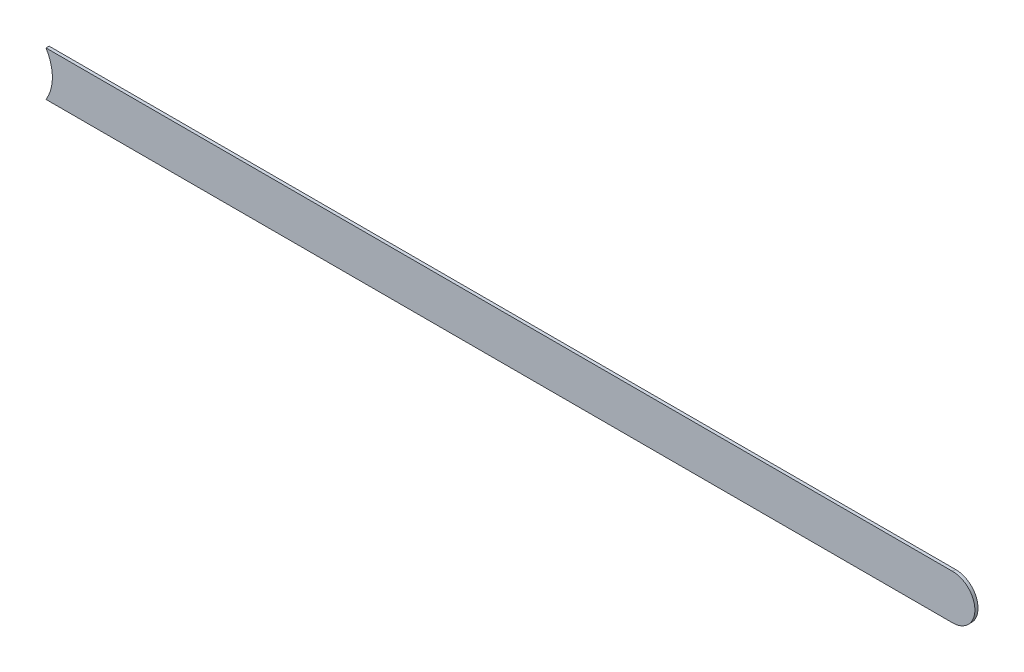
ISO-10303-21;
HEADER;
FILE_DESCRIPTION(('STEP AP214'),'2;1');
FILE_NAME('part.step','',(''),(''),'','','');
FILE_SCHEMA(('AUTOMOTIVE_DESIGN { 1 0 10303 214 1 1 1 1 }'));
ENDSEC;
DATA;
#1=APPLICATION_CONTEXT('core data for automotive mechanical design processes');
#2=APPLICATION_PROTOCOL_DEFINITION('international standard','automotive_design',2000,#1);
#3=PRODUCT_CONTEXT('',#1,'mechanical');
#4=PRODUCT('Part','Part','',(#3));
#5=PRODUCT_RELATED_PRODUCT_CATEGORY('part','',(#4));
#6=PRODUCT_DEFINITION_FORMATION('','',#4);
#7=PRODUCT_DEFINITION_CONTEXT('part definition',#1,'design');
#8=PRODUCT_DEFINITION('design','',#6,#7);
#9=PRODUCT_DEFINITION_SHAPE('','',#8);
#10=(LENGTH_UNIT() NAMED_UNIT(*) SI_UNIT(.MILLI.,.METRE.));
#11=(NAMED_UNIT(*) PLANE_ANGLE_UNIT() SI_UNIT($,.RADIAN.));
#12=(NAMED_UNIT(*) SI_UNIT($,.STERADIAN.) SOLID_ANGLE_UNIT());
#13=UNCERTAINTY_MEASURE_WITH_UNIT(LENGTH_MEASURE(1.E-05),#10,'distance_accuracy_value','');
#14=(GEOMETRIC_REPRESENTATION_CONTEXT(3) GLOBAL_UNCERTAINTY_ASSIGNED_CONTEXT((#13)) GLOBAL_UNIT_ASSIGNED_CONTEXT((#10,
#11,#12)) REPRESENTATION_CONTEXT('',''));
#15=CARTESIAN_POINT('',(0.,0.,0.));
#16=DIRECTION('',(0.,0.,1.));
#17=DIRECTION('',(1.,0.,0.));
#18=AXIS2_PLACEMENT_3D('',#15,#16,#17);
#19=CARTESIAN_POINT('',(80.,-100.126,1.6));
#20=DIRECTION('',(0.,1.,0.));
#21=DIRECTION('',(1.,0.,0.));
#22=AXIS2_PLACEMENT_3D('',#19,#20,#21);
#23=PLANE('',#22);
#24=DIRECTION('',(0.,0.,1.));
#25=VECTOR('',#24,1.);
#26=CARTESIAN_POINT('',(90.564,-100.126,1.6));
#27=LINE('',#26,#25);
#28=CARTESIAN_POINT('',(90.564,-100.126,1.6));
#29=VERTEX_POINT('',#28);
#30=CARTESIAN_POINT('',(90.564,-100.126,1.635));
#31=VERTEX_POINT('',#30);
#32=EDGE_CURVE('E11',#29,#31,#27,.T.);
#33=ORIENTED_EDGE('',*,*,#32,.T.);
#34=DIRECTION('',(1.,0.,0.));
#35=VECTOR('',#34,1.);
#36=CARTESIAN_POINT('',(80.,-100.126,1.635));
#37=LINE('',#36,#35);
#38=CARTESIAN_POINT('',(80.403887360534,-100.126,1.635));
#39=VERTEX_POINT('',#38);
#40=EDGE_CURVE('E20',#39,#31,#37,.T.);
#41=ORIENTED_EDGE('',*,*,#40,.F.);
#42=DIRECTION('',(0.,0.,-1.));
#43=VECTOR('',#42,1.);
#44=CARTESIAN_POINT('',(80.403887360535,-100.126,-0.045));
#45=LINE('',#44,#43);
#46=CARTESIAN_POINT('',(80.403887360534,-100.126,1.6));
#47=VERTEX_POINT('',#46);
#48=EDGE_CURVE('E74',#39,#47,#45,.T.);
#49=ORIENTED_EDGE('',*,*,#48,.T.);
#50=DIRECTION('',(1.,0.,0.));
#51=VECTOR('',#50,1.);
#52=CARTESIAN_POINT('',(80.,-100.126,1.6));
#53=LINE('',#52,#51);
#54=EDGE_CURVE('E102',#47,#29,#53,.T.);
#55=ORIENTED_EDGE('',*,*,#54,.T.);
#56=EDGE_LOOP('',(#33,#41,#49,#55));
#57=FACE_BOUND('',#56,.T.);
#58=ADVANCED_FACE('F17',(#57),#23,.F.);
#59=CARTESIAN_POINT('',(90.564,-99.876,1.6));
#60=DIRECTION('',(0.,0.,-1.));
#61=DIRECTION('',(0.,-1.,0.));
#62=AXIS2_PLACEMENT_3D('',#59,#60,#61);
#63=CYLINDRICAL_SURFACE('',#62,0.25);
#64=CARTESIAN_POINT('',(90.564,-99.876,1.6));
#65=DIRECTION('',(0.,0.,1.));
#66=DIRECTION('',(0.,-1.,0.));
#67=AXIS2_PLACEMENT_3D('',#64,#65,#66);
#68=CIRCLE('',#67,0.25);
#69=CARTESIAN_POINT('',(90.564,-99.626,1.6));
#70=VERTEX_POINT('',#69);
#71=EDGE_CURVE('E77',#29,#70,#68,.T.);
#72=ORIENTED_EDGE('',*,*,#71,.T.);
#73=DIRECTION('',(0.,0.,1.));
#74=VECTOR('',#73,1.);
#75=CARTESIAN_POINT('',(90.564,-99.626,1.6));
#76=LINE('',#75,#74);
#77=CARTESIAN_POINT('',(90.564,-99.626,1.635));
#78=VERTEX_POINT('',#77);
#79=EDGE_CURVE('E88',#70,#78,#76,.T.);
#80=ORIENTED_EDGE('',*,*,#79,.T.);
#81=CARTESIAN_POINT('',(90.564,-99.876,1.635));
#82=DIRECTION('',(0.,0.,1.));
#83=DIRECTION('',(0.,-1.,0.));
#84=AXIS2_PLACEMENT_3D('',#81,#82,#83);
#85=CIRCLE('',#84,0.25);
#86=EDGE_CURVE('E83',#31,#78,#85,.T.);
#87=ORIENTED_EDGE('',*,*,#86,.F.);
#88=ORIENTED_EDGE('',*,*,#32,.F.);
#89=EDGE_LOOP('',(#72,#80,#87,#88));
#90=FACE_BOUND('',#89,.T.);
#91=ADVANCED_FACE('F120',(#90),#63,.T.);
#92=CARTESIAN_POINT('',(90.564,-99.626,1.635));
#93=DIRECTION('',(0.,0.,1.));
#94=DIRECTION('',(1.,0.,0.));
#95=AXIS2_PLACEMENT_3D('',#92,#93,#94);
#96=PLANE('',#95);
#97=ORIENTED_EDGE('',*,*,#86,.T.);
#98=DIRECTION('',(-1.,0.,0.));
#99=VECTOR('',#98,1.);
#100=CARTESIAN_POINT('',(90.564,-99.626,1.635));
#101=LINE('',#100,#99);
#102=CARTESIAN_POINT('',(80.403887360523,-99.626,1.635));
#103=VERTEX_POINT('',#102);
#104=EDGE_CURVE('E80',#78,#103,#101,.T.);
#105=ORIENTED_EDGE('',*,*,#104,.T.);
#106=CARTESIAN_POINT('',(80.,-99.876,1.635));
#107=DIRECTION('',(0.,0.,-1.));
#108=DIRECTION('',(0.,-1.,0.));
#109=AXIS2_PLACEMENT_3D('',#106,#107,#108);
#110=CIRCLE('',#109,0.475);
#111=EDGE_CURVE('E68',#103,#39,#110,.T.);
#112=ORIENTED_EDGE('',*,*,#111,.T.);
#113=ORIENTED_EDGE('',*,*,#40,.T.);
#114=EDGE_LOOP('',(#97,#105,#112,#113));
#115=FACE_BOUND('',#114,.T.);
#116=ADVANCED_FACE('F81',(#115),#96,.T.);
#117=CARTESIAN_POINT('',(80.,-99.876,-0.045));
#118=DIRECTION('',(0.,0.,-1.));
#119=DIRECTION('',(0.,-1.,0.));
#120=AXIS2_PLACEMENT_3D('',#117,#118,#119);
#121=CYLINDRICAL_SURFACE('',#120,0.475);
#122=ORIENTED_EDGE('',*,*,#111,.F.);
#123=DIRECTION('',(0.,0.,-1.));
#124=VECTOR('',#123,1.);
#125=CARTESIAN_POINT('',(80.403887360535,-99.626,-0.045));
#126=LINE('',#125,#124);
#127=CARTESIAN_POINT('',(80.403887360523,-99.626,1.6));
#128=VERTEX_POINT('',#127);
#129=EDGE_CURVE('E73',#103,#128,#126,.T.);
#130=ORIENTED_EDGE('',*,*,#129,.T.);
#131=CARTESIAN_POINT('',(80.,-99.876,1.6));
#132=DIRECTION('',(0.,0.,-1.));
#133=DIRECTION('',(0.,-1.,0.));
#134=AXIS2_PLACEMENT_3D('',#131,#132,#133);
#135=CIRCLE('',#134,0.475);
#136=EDGE_CURVE('E100',#128,#47,#135,.T.);
#137=ORIENTED_EDGE('',*,*,#136,.T.);
#138=ORIENTED_EDGE('',*,*,#48,.F.);
#139=EDGE_LOOP('',(#122,#130,#137,#138));
#140=FACE_BOUND('',#139,.T.);
#141=ADVANCED_FACE('F70',(#140),#121,.F.);
#142=CARTESIAN_POINT('',(90.564,-99.626,1.6));
#143=DIRECTION('',(0.,0.,1.));
#144=DIRECTION('',(1.,0.,0.));
#145=AXIS2_PLACEMENT_3D('',#142,#143,#144);
#146=PLANE('',#145);
#147=ORIENTED_EDGE('',*,*,#54,.F.);
#148=ORIENTED_EDGE('',*,*,#136,.F.);
#149=DIRECTION('',(-1.,0.,0.));
#150=VECTOR('',#149,1.);
#151=CARTESIAN_POINT('',(90.564,-99.626,1.6));
#152=LINE('',#151,#150);
#153=EDGE_CURVE('E93',#70,#128,#152,.T.);
#154=ORIENTED_EDGE('',*,*,#153,.F.);
#155=ORIENTED_EDGE('',*,*,#71,.F.);
#156=EDGE_LOOP('',(#147,#148,#154,#155));
#157=FACE_BOUND('',#156,.T.);
#158=ADVANCED_FACE('F124',(#157),#146,.F.);
#159=CARTESIAN_POINT('',(90.564,-99.626,1.6));
#160=DIRECTION('',(0.,-1.,0.));
#161=DIRECTION('',(0.,0.,-1.));
#162=AXIS2_PLACEMENT_3D('',#159,#160,#161);
#163=PLANE('',#162);
#164=ORIENTED_EDGE('',*,*,#129,.F.);
#165=ORIENTED_EDGE('',*,*,#104,.F.);
#166=ORIENTED_EDGE('',*,*,#79,.F.);
#167=ORIENTED_EDGE('',*,*,#153,.T.);
#168=EDGE_LOOP('',(#164,#165,#166,#167));
#169=FACE_BOUND('',#168,.T.);
#170=ADVANCED_FACE('F91',(#169),#163,.F.);
#171=CLOSED_SHELL('',(#58,#91,#116,#141,#158,#170));
#172=MANIFOLD_SOLID_BREP('B1',#171);
#173=ADVANCED_BREP_SHAPE_REPRESENTATION('',(#18,#172),#14);
#174=SHAPE_DEFINITION_REPRESENTATION(#9,#173);
ENDSEC;
END-ISO-10303-21;
